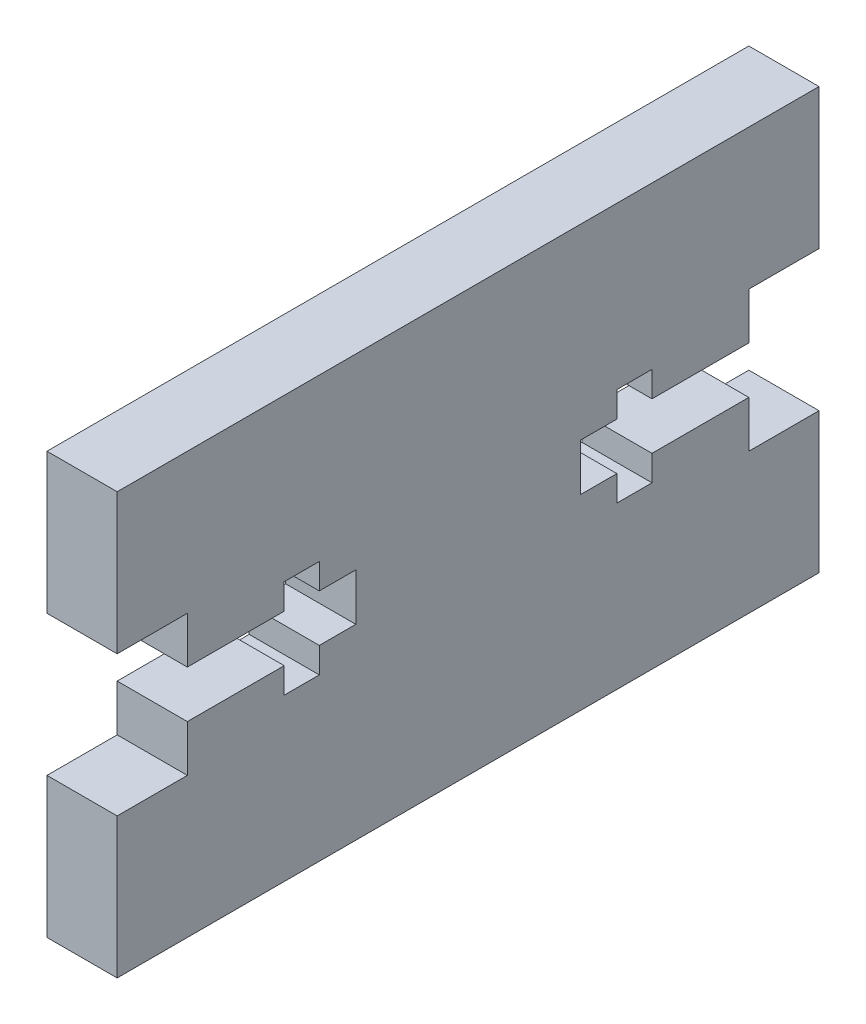
ISO-10303-21;
HEADER;
FILE_DESCRIPTION(('STEP AP214'),'2;1');
FILE_NAME('part.step','',(''),(''),'','','');
FILE_SCHEMA(('AUTOMOTIVE_DESIGN { 1 0 10303 214 1 1 1 1 }'));
ENDSEC;
DATA;
#1=APPLICATION_CONTEXT('core data for automotive mechanical design processes');
#2=APPLICATION_PROTOCOL_DEFINITION('international standard','automotive_design',2000,#1);
#3=PRODUCT_CONTEXT('',#1,'mechanical');
#4=PRODUCT('Part','Part','',(#3));
#5=PRODUCT_RELATED_PRODUCT_CATEGORY('part','',(#4));
#6=PRODUCT_DEFINITION_FORMATION('','',#4);
#7=PRODUCT_DEFINITION_CONTEXT('part definition',#1,'design');
#8=PRODUCT_DEFINITION('design','',#6,#7);
#9=PRODUCT_DEFINITION_SHAPE('','',#8);
#10=(LENGTH_UNIT() NAMED_UNIT(*) SI_UNIT(.MILLI.,.METRE.));
#11=(NAMED_UNIT(*) PLANE_ANGLE_UNIT() SI_UNIT($,.RADIAN.));
#12=(NAMED_UNIT(*) SI_UNIT($,.STERADIAN.) SOLID_ANGLE_UNIT());
#13=UNCERTAINTY_MEASURE_WITH_UNIT(LENGTH_MEASURE(1.E-05),#10,'distance_accuracy_value','');
#14=(GEOMETRIC_REPRESENTATION_CONTEXT(3) GLOBAL_UNCERTAINTY_ASSIGNED_CONTEXT((#13)) GLOBAL_UNIT_ASSIGNED_CONTEXT((#10,
#11,#12)) REPRESENTATION_CONTEXT('',''));
#15=CARTESIAN_POINT('',(0.,0.,0.));
#16=DIRECTION('',(0.,0.,1.));
#17=DIRECTION('',(1.,0.,0.));
#18=AXIS2_PLACEMENT_3D('',#15,#16,#17);
#19=CARTESIAN_POINT('',(-17.78,-19.05,50.8));
#20=DIRECTION('',(1.,0.,0.));
#21=DIRECTION('',(0.,0.,-1.));
#22=AXIS2_PLACEMENT_3D('',#19,#20,#21);
#23=PLANE('',#22);
#24=DIRECTION('',(0.,0.,-1.));
#25=VECTOR('',#24,1.);
#26=CARTESIAN_POINT('',(-17.78,-2.13359999999999,42.037));
#27=LINE('',#26,#25);
#28=CARTESIAN_POINT('',(-17.78,-2.13360000000003,50.8));
#29=VERTEX_POINT('',#28);
#30=CARTESIAN_POINT('',(-17.78,-2.13359999999999,42.037));
#31=VERTEX_POINT('',#30);
#32=EDGE_CURVE('E264',#29,#31,#27,.T.);
#33=ORIENTED_EDGE('',*,*,#32,.T.);
#34=DIRECTION('',(0.,-1.,0.));
#35=VECTOR('',#34,1.);
#36=CARTESIAN_POINT('',(-17.78,-4.44499999999999,42.037));
#37=LINE('',#36,#35);
#38=CARTESIAN_POINT('',(-17.78,-4.44499999999999,42.037));
#39=VERTEX_POINT('',#38);
#40=EDGE_CURVE('E963',#31,#39,#37,.T.);
#41=ORIENTED_EDGE('',*,*,#40,.T.);
#42=DIRECTION('',(0.,0.,-1.));
#43=VECTOR('',#42,1.);
#44=CARTESIAN_POINT('',(-17.78,-4.44499999999998,38.862));
#45=LINE('',#44,#43);
#46=CARTESIAN_POINT('',(-17.78,-4.44499999999998,38.862));
#47=VERTEX_POINT('',#46);
#48=EDGE_CURVE('E981',#39,#47,#45,.T.);
#49=ORIENTED_EDGE('',*,*,#48,.T.);
#50=DIRECTION('',(0.,1.,0.));
#51=VECTOR('',#50,1.);
#52=CARTESIAN_POINT('',(-17.78,-2.13359999999998,38.862));
#53=LINE('',#52,#51);
#54=CARTESIAN_POINT('',(-17.78,-2.13359999999998,38.862));
#55=VERTEX_POINT('',#54);
#56=EDGE_CURVE('E984',#47,#55,#53,.T.);
#57=ORIENTED_EDGE('',*,*,#56,.T.);
#58=DIRECTION('',(0.,0.,-1.));
#59=VECTOR('',#58,1.);
#60=CARTESIAN_POINT('',(-17.78,-2.13359999999998,38.862));
#61=LINE('',#60,#59);
#62=CARTESIAN_POINT('',(-17.78,-2.13359999999997,35.56));
#63=VERTEX_POINT('',#62);
#64=EDGE_CURVE('E987',#55,#63,#61,.T.);
#65=ORIENTED_EDGE('',*,*,#64,.T.);
#66=DIRECTION('',(0.,1.,0.));
#67=VECTOR('',#66,1.);
#68=CARTESIAN_POINT('',(-17.78,-2.13359999999997,35.56));
#69=LINE('',#68,#67);
#70=CARTESIAN_POINT('',(-17.78,2.13360000000003,35.56));
#71=VERTEX_POINT('',#70);
#72=EDGE_CURVE('E990',#63,#71,#69,.T.);
#73=ORIENTED_EDGE('',*,*,#72,.T.);
#74=DIRECTION('',(0.,0.,1.));
#75=VECTOR('',#74,1.);
#76=CARTESIAN_POINT('',(-17.78,2.13360000000002,38.862));
#77=LINE('',#76,#75);
#78=CARTESIAN_POINT('',(-17.78,2.13360000000002,38.862));
#79=VERTEX_POINT('',#78);
#80=EDGE_CURVE('E993',#71,#79,#77,.T.);
#81=ORIENTED_EDGE('',*,*,#80,.T.);
#82=DIRECTION('',(0.,1.,0.));
#83=VECTOR('',#82,1.);
#84=CARTESIAN_POINT('',(-17.78,2.13360000000002,38.862));
#85=LINE('',#84,#83);
#86=CARTESIAN_POINT('',(-17.78,4.44500000000002,38.862));
#87=VERTEX_POINT('',#86);
#88=EDGE_CURVE('E996',#79,#87,#85,.T.);
#89=ORIENTED_EDGE('',*,*,#88,.T.);
#90=DIRECTION('',(0.,0.,1.));
#91=VECTOR('',#90,1.);
#92=CARTESIAN_POINT('',(-17.78,4.44500000000002,38.862));
#93=LINE('',#92,#91);
#94=CARTESIAN_POINT('',(-17.78,4.445,42.037));
#95=VERTEX_POINT('',#94);
#96=EDGE_CURVE('E999',#87,#95,#93,.T.);
#97=ORIENTED_EDGE('',*,*,#96,.T.);
#98=DIRECTION('',(0.,-1.,0.));
#99=VECTOR('',#98,1.);
#100=CARTESIAN_POINT('',(-17.78,4.445,42.037));
#101=LINE('',#100,#99);
#102=CARTESIAN_POINT('',(-17.78,2.13360000000001,42.037));
#103=VERTEX_POINT('',#102);
#104=EDGE_CURVE('E1002',#95,#103,#101,.T.);
#105=ORIENTED_EDGE('',*,*,#104,.T.);
#106=DIRECTION('',(0.,0.,1.));
#107=VECTOR('',#106,1.);
#108=CARTESIAN_POINT('',(-17.78,2.13360000000001,42.037));
#109=LINE('',#108,#107);
#110=CARTESIAN_POINT('',(-17.78,2.13359999999997,50.8));
#111=VERTEX_POINT('',#110);
#112=EDGE_CURVE('E275',#103,#111,#109,.T.);
#113=ORIENTED_EDGE('',*,*,#112,.T.);
#114=DIRECTION('',(0.,-1.,0.));
#115=VECTOR('',#114,1.);
#116=CARTESIAN_POINT('',(-17.78,-19.05,50.8));
#117=LINE('',#116,#115);
#118=CARTESIAN_POINT('',(-17.78,6.35,50.8));
#119=VERTEX_POINT('',#118);
#120=EDGE_CURVE('E291',#119,#111,#117,.T.);
#121=ORIENTED_EDGE('',*,*,#120,.F.);
#122=DIRECTION('',(0.,0.,-1.));
#123=VECTOR('',#122,1.);
#124=CARTESIAN_POINT('',(-17.78,6.35,57.15));
#125=LINE('',#124,#123);
#126=CARTESIAN_POINT('',(-17.78,6.35,57.15));
#127=VERTEX_POINT('',#126);
#128=EDGE_CURVE('E324',#127,#119,#125,.T.);
#129=ORIENTED_EDGE('',*,*,#128,.F.);
#130=DIRECTION('',(0.,1.,0.));
#131=VECTOR('',#130,1.);
#132=CARTESIAN_POINT('',(-17.78,19.05,57.15));
#133=LINE('',#132,#131);
#134=CARTESIAN_POINT('',(-17.78,19.05,57.15));
#135=VERTEX_POINT('',#134);
#136=EDGE_CURVE('E487',#127,#135,#133,.T.);
#137=ORIENTED_EDGE('',*,*,#136,.T.);
#138=DIRECTION('',(0.,0.,-1.));
#139=VECTOR('',#138,1.);
#140=CARTESIAN_POINT('',(-17.78,19.05,50.8));
#141=LINE('',#140,#139);
#142=CARTESIAN_POINT('',(-17.78,19.05,-6.35));
#143=VERTEX_POINT('',#142);
#144=EDGE_CURVE('E482',#135,#143,#141,.T.);
#145=ORIENTED_EDGE('',*,*,#144,.T.);
#146=DIRECTION('',(0.,1.,0.));
#147=VECTOR('',#146,1.);
#148=CARTESIAN_POINT('',(-17.78,19.05,-6.35));
#149=LINE('',#148,#147);
#150=CARTESIAN_POINT('',(-17.78,6.35,-6.35));
#151=VERTEX_POINT('',#150);
#152=EDGE_CURVE('E387',#151,#143,#149,.T.);
#153=ORIENTED_EDGE('',*,*,#152,.F.);
#154=DIRECTION('',(0.,0.,1.));
#155=VECTOR('',#154,1.);
#156=CARTESIAN_POINT('',(-17.78,6.35,-6.35));
#157=LINE('',#156,#155);
#158=CARTESIAN_POINT('',(-17.78,6.35,0.));
#159=VERTEX_POINT('',#158);
#160=EDGE_CURVE('E397',#151,#159,#157,.T.);
#161=ORIENTED_EDGE('',*,*,#160,.T.);
#162=DIRECTION('',(0.,-1.,0.));
#163=VECTOR('',#162,1.);
#164=CARTESIAN_POINT('',(-17.78,-19.05,0.));
#165=LINE('',#164,#163);
#166=CARTESIAN_POINT('',(-17.78,2.13359999999997,0.));
#167=VERTEX_POINT('',#166);
#168=EDGE_CURVE('E433',#159,#167,#165,.T.);
#169=ORIENTED_EDGE('',*,*,#168,.T.);
#170=DIRECTION('',(0.,0.,-1.));
#171=VECTOR('',#170,1.);
#172=CARTESIAN_POINT('',(-17.78,2.13360000000001,8.76299999999999));
#173=LINE('',#172,#171);
#174=CARTESIAN_POINT('',(-17.78,2.13360000000001,8.76299999999999));
#175=VERTEX_POINT('',#174);
#176=EDGE_CURVE('E359',#175,#167,#173,.T.);
#177=ORIENTED_EDGE('',*,*,#176,.F.);
#178=DIRECTION('',(0.,-1.,0.));
#179=VECTOR('',#178,1.);
#180=CARTESIAN_POINT('',(-17.78,4.445,8.76299999999997));
#181=LINE('',#180,#179);
#182=CARTESIAN_POINT('',(-17.78,4.445,8.76299999999997));
#183=VERTEX_POINT('',#182);
#184=EDGE_CURVE('E356',#183,#175,#181,.T.);
#185=ORIENTED_EDGE('',*,*,#184,.F.);
#186=DIRECTION('',(0.,0.,-1.));
#187=VECTOR('',#186,1.);
#188=CARTESIAN_POINT('',(-17.78,4.44500000000002,11.938));
#189=LINE('',#188,#187);
#190=CARTESIAN_POINT('',(-17.78,4.44500000000002,11.938));
#191=VERTEX_POINT('',#190);
#192=EDGE_CURVE('E353',#191,#183,#189,.T.);
#193=ORIENTED_EDGE('',*,*,#192,.F.);
#194=DIRECTION('',(0.,1.,0.));
#195=VECTOR('',#194,1.);
#196=CARTESIAN_POINT('',(-17.78,2.13360000000002,11.938));
#197=LINE('',#196,#195);
#198=CARTESIAN_POINT('',(-17.78,2.13360000000002,11.938));
#199=VERTEX_POINT('',#198);
#200=EDGE_CURVE('E350',#199,#191,#197,.T.);
#201=ORIENTED_EDGE('',*,*,#200,.F.);
#202=DIRECTION('',(0.,0.,-1.));
#203=VECTOR('',#202,1.);
#204=CARTESIAN_POINT('',(-17.78,2.13360000000002,11.938));
#205=LINE('',#204,#203);
#206=CARTESIAN_POINT('',(-17.78,2.13360000000003,15.24));
#207=VERTEX_POINT('',#206);
#208=EDGE_CURVE('E347',#207,#199,#205,.T.);
#209=ORIENTED_EDGE('',*,*,#208,.F.);
#210=DIRECTION('',(0.,1.,0.));
#211=VECTOR('',#210,1.);
#212=CARTESIAN_POINT('',(-17.78,-2.13359999999997,15.24));
#213=LINE('',#212,#211);
#214=CARTESIAN_POINT('',(-17.78,-2.13359999999997,15.24));
#215=VERTEX_POINT('',#214);
#216=EDGE_CURVE('E344',#215,#207,#213,.T.);
#217=ORIENTED_EDGE('',*,*,#216,.F.);
#218=DIRECTION('',(0.,0.,1.));
#219=VECTOR('',#218,1.);
#220=CARTESIAN_POINT('',(-17.78,-2.13359999999998,11.938));
#221=LINE('',#220,#219);
#222=CARTESIAN_POINT('',(-17.78,-2.13359999999998,11.938));
#223=VERTEX_POINT('',#222);
#224=EDGE_CURVE('E341',#223,#215,#221,.T.);
#225=ORIENTED_EDGE('',*,*,#224,.F.);
#226=DIRECTION('',(0.,1.,0.));
#227=VECTOR('',#226,1.);
#228=CARTESIAN_POINT('',(-17.78,-2.13359999999998,11.938));
#229=LINE('',#228,#227);
#230=CARTESIAN_POINT('',(-17.78,-4.44499999999998,11.938));
#231=VERTEX_POINT('',#230);
#232=EDGE_CURVE('E338',#231,#223,#229,.T.);
#233=ORIENTED_EDGE('',*,*,#232,.F.);
#234=DIRECTION('',(0.,0.,1.));
#235=VECTOR('',#234,1.);
#236=CARTESIAN_POINT('',(-17.78,-4.44499999999998,11.938));
#237=LINE('',#236,#235);
#238=CARTESIAN_POINT('',(-17.78,-4.44499999999999,8.76300000000002));
#239=VERTEX_POINT('',#238);
#240=EDGE_CURVE('E335',#239,#231,#237,.T.);
#241=ORIENTED_EDGE('',*,*,#240,.F.);
#242=DIRECTION('',(0.,-1.,0.));
#243=VECTOR('',#242,1.);
#244=CARTESIAN_POINT('',(-17.78,-4.44499999999999,8.76300000000002));
#245=LINE('',#244,#243);
#246=CARTESIAN_POINT('',(-17.78,-2.13359999999999,8.76299999999999));
#247=VERTEX_POINT('',#246);
#248=EDGE_CURVE('E332',#247,#239,#245,.T.);
#249=ORIENTED_EDGE('',*,*,#248,.F.);
#250=DIRECTION('',(0.,0.,1.));
#251=VECTOR('',#250,1.);
#252=CARTESIAN_POINT('',(-17.78,-2.13359999999999,8.76299999999999));
#253=LINE('',#252,#251);
#254=CARTESIAN_POINT('',(-17.78,-2.13360000000003,0.));
#255=VERTEX_POINT('',#254);
#256=EDGE_CURVE('E319',#255,#247,#253,.T.);
#257=ORIENTED_EDGE('',*,*,#256,.F.);
#258=CARTESIAN_POINT('',(-17.78,-6.35,0.));
#259=VERTEX_POINT('',#258);
#260=EDGE_CURVE('E425',#255,#259,#165,.T.);
#261=ORIENTED_EDGE('',*,*,#260,.T.);
#262=DIRECTION('',(0.,0.,1.));
#263=VECTOR('',#262,1.);
#264=CARTESIAN_POINT('',(-17.78,-6.35,-6.35));
#265=LINE('',#264,#263);
#266=CARTESIAN_POINT('',(-17.78,-6.35,-6.35));
#267=VERTEX_POINT('',#266);
#268=EDGE_CURVE('E419',#267,#259,#265,.T.);
#269=ORIENTED_EDGE('',*,*,#268,.F.);
#270=DIRECTION('',(0.,1.,0.));
#271=VECTOR('',#270,1.);
#272=CARTESIAN_POINT('',(-17.78,-19.05,-6.35));
#273=LINE('',#272,#271);
#274=CARTESIAN_POINT('',(-17.78,-19.05,-6.35));
#275=VERTEX_POINT('',#274);
#276=EDGE_CURVE('E405',#275,#267,#273,.T.);
#277=ORIENTED_EDGE('',*,*,#276,.F.);
#278=DIRECTION('',(0.,0.,-1.));
#279=VECTOR('',#278,1.);
#280=CARTESIAN_POINT('',(-17.78,-19.05,50.8));
#281=LINE('',#280,#279);
#282=CARTESIAN_POINT('',(-17.78,-19.05,57.15));
#283=VERTEX_POINT('',#282);
#284=EDGE_CURVE('E474',#283,#275,#281,.T.);
#285=ORIENTED_EDGE('',*,*,#284,.F.);
#286=DIRECTION('',(0.,1.,0.));
#287=VECTOR('',#286,1.);
#288=CARTESIAN_POINT('',(-17.78,-19.05,57.15));
#289=LINE('',#288,#287);
#290=CARTESIAN_POINT('',(-17.78,-6.35,57.15));
#291=VERTEX_POINT('',#290);
#292=EDGE_CURVE('E323',#283,#291,#289,.T.);
#293=ORIENTED_EDGE('',*,*,#292,.T.);
#294=DIRECTION('',(0.,0.,-1.));
#295=VECTOR('',#294,1.);
#296=CARTESIAN_POINT('',(-17.78,-6.35,57.15));
#297=LINE('',#296,#295);
#298=CARTESIAN_POINT('',(-17.78,-6.35,50.8));
#299=VERTEX_POINT('',#298);
#300=EDGE_CURVE('E289',#291,#299,#297,.T.);
#301=ORIENTED_EDGE('',*,*,#300,.T.);
#302=EDGE_CURVE('E281',#29,#299,#117,.T.);
#303=ORIENTED_EDGE('',*,*,#302,.F.);
#304=EDGE_LOOP('',(#33,#41,#49,#57,#65,#73,#81,#89,#97,#105,#113,#121,#129,#137,#145,#153,#161,
#169,#177,#185,#193,#201,#209,#217,#225,#233,#241,#249,#257,#261,#269,#277,#285,#293,#301,#303));
#305=FACE_BOUND('',#304,.T.);
#306=ADVANCED_FACE('F33',(#305),#23,.F.);
#307=CARTESIAN_POINT('',(-11.43,-19.05,50.8));
#308=DIRECTION('',(-1.,0.,0.));
#309=DIRECTION('',(0.,0.,1.));
#310=AXIS2_PLACEMENT_3D('',#307,#308,#309);
#311=PLANE('',#310);
#312=DIRECTION('',(0.,0.,-1.));
#313=VECTOR('',#312,1.);
#314=CARTESIAN_POINT('',(-11.43,-2.13360000000002,50.8000000000001));
#315=LINE('',#314,#313);
#316=CARTESIAN_POINT('',(-11.43,-2.13360000000003,50.8));
#317=VERTEX_POINT('',#316);
#318=CARTESIAN_POINT('',(-11.43,-2.13359999999999,42.037));
#319=VERTEX_POINT('',#318);
#320=EDGE_CURVE('E613',#317,#319,#315,.T.);
#321=ORIENTED_EDGE('',*,*,#320,.F.);
#322=DIRECTION('',(0.,1.,0.));
#323=VECTOR('',#322,1.);
#324=CARTESIAN_POINT('',(-11.43,-19.05,50.8));
#325=LINE('',#324,#323);
#326=CARTESIAN_POINT('',(-11.43,-6.35,50.8));
#327=VERTEX_POINT('',#326);
#328=EDGE_CURVE('E284',#327,#317,#325,.T.);
#329=ORIENTED_EDGE('',*,*,#328,.F.);
#330=DIRECTION('',(0.,0.,-1.));
#331=VECTOR('',#330,1.);
#332=CARTESIAN_POINT('',(-11.43,-6.35,57.15));
#333=LINE('',#332,#331);
#334=CARTESIAN_POINT('',(-11.43,-6.35,57.15));
#335=VERTEX_POINT('',#334);
#336=EDGE_CURVE('E314',#335,#327,#333,.T.);
#337=ORIENTED_EDGE('',*,*,#336,.F.);
#338=DIRECTION('',(0.,-1.,0.));
#339=VECTOR('',#338,1.);
#340=CARTESIAN_POINT('',(-11.43,-19.05,57.15));
#341=LINE('',#340,#339);
#342=CARTESIAN_POINT('',(-11.43,-19.05,57.15));
#343=VERTEX_POINT('',#342);
#344=EDGE_CURVE('E624',#335,#343,#341,.T.);
#345=ORIENTED_EDGE('',*,*,#344,.T.);
#346=DIRECTION('',(0.,0.,-1.));
#347=VECTOR('',#346,1.);
#348=CARTESIAN_POINT('',(-11.43,-19.05,50.8));
#349=LINE('',#348,#347);
#350=CARTESIAN_POINT('',(-11.43,-19.05,-6.35));
#351=VERTEX_POINT('',#350);
#352=EDGE_CURVE('E475',#343,#351,#349,.T.);
#353=ORIENTED_EDGE('',*,*,#352,.T.);
#354=DIRECTION('',(0.,-1.,0.));
#355=VECTOR('',#354,1.);
#356=CARTESIAN_POINT('',(-11.43,-19.05,-6.35));
#357=LINE('',#356,#355);
#358=CARTESIAN_POINT('',(-11.43,-6.35,-6.35));
#359=VERTEX_POINT('',#358);
#360=EDGE_CURVE('E410',#359,#351,#357,.T.);
#361=ORIENTED_EDGE('',*,*,#360,.F.);
#362=DIRECTION('',(0.,0.,1.));
#363=VECTOR('',#362,1.);
#364=CARTESIAN_POINT('',(-11.43,-6.35,-6.35));
#365=LINE('',#364,#363);
#366=CARTESIAN_POINT('',(-11.43,-6.35,0.));
#367=VERTEX_POINT('',#366);
#368=EDGE_CURVE('E414',#359,#367,#365,.T.);
#369=ORIENTED_EDGE('',*,*,#368,.T.);
#370=DIRECTION('',(0.,1.,0.));
#371=VECTOR('',#370,1.);
#372=CARTESIAN_POINT('',(-11.43,-19.05,0.));
#373=LINE('',#372,#371);
#374=CARTESIAN_POINT('',(-11.43,-2.13360000000003,0.));
#375=VERTEX_POINT('',#374);
#376=EDGE_CURVE('E292',#367,#375,#373,.T.);
#377=ORIENTED_EDGE('',*,*,#376,.T.);
#378=DIRECTION('',(0.,0.,1.));
#379=VECTOR('',#378,1.);
#380=CARTESIAN_POINT('',(-11.43,-2.13359999999984,50.7999999999999));
#381=LINE('',#380,#379);
#382=CARTESIAN_POINT('',(-11.43,-2.13359999999999,8.76299999999999));
#383=VERTEX_POINT('',#382);
#384=EDGE_CURVE('E443',#375,#383,#381,.T.);
#385=ORIENTED_EDGE('',*,*,#384,.T.);
#386=DIRECTION('',(0.,-1.,0.));
#387=VECTOR('',#386,1.);
#388=CARTESIAN_POINT('',(-11.43,-19.0500000000005,8.76300000000019));
#389=LINE('',#388,#387);
#390=CARTESIAN_POINT('',(-11.43,-4.44499999999999,8.76300000000002));
#391=VERTEX_POINT('',#390);
#392=EDGE_CURVE('E472',#383,#391,#389,.T.);
#393=ORIENTED_EDGE('',*,*,#392,.T.);
#394=DIRECTION('',(0.,0.,1.));
#395=VECTOR('',#394,1.);
#396=CARTESIAN_POINT('',(-11.43,-4.44499999999984,50.7999999999999));
#397=LINE('',#396,#395);
#398=CARTESIAN_POINT('',(-11.43,-4.44499999999998,11.938));
#399=VERTEX_POINT('',#398);
#400=EDGE_CURVE('E470',#391,#399,#397,.T.);
#401=ORIENTED_EDGE('',*,*,#400,.T.);
#402=DIRECTION('',(0.,1.,0.));
#403=VECTOR('',#402,1.);
#404=CARTESIAN_POINT('',(-11.43,-19.0500000000005,11.9380000000002));
#405=LINE('',#404,#403);
#406=CARTESIAN_POINT('',(-11.43,-2.13359999999998,11.938));
#407=VERTEX_POINT('',#406);
#408=EDGE_CURVE('E467',#399,#407,#405,.T.);
#409=ORIENTED_EDGE('',*,*,#408,.T.);
#410=DIRECTION('',(0.,0.,1.));
#411=VECTOR('',#410,1.);
#412=CARTESIAN_POINT('',(-11.43,-2.13359999999985,50.7999999999999));
#413=LINE('',#412,#411);
#414=CARTESIAN_POINT('',(-11.43,-2.13359999999997,15.24));
#415=VERTEX_POINT('',#414);
#416=EDGE_CURVE('E464',#407,#415,#413,.T.);
#417=ORIENTED_EDGE('',*,*,#416,.T.);
#418=DIRECTION('',(0.,1.,0.));
#419=VECTOR('',#418,1.);
#420=CARTESIAN_POINT('',(-11.43,-19.05,15.24));
#421=LINE('',#420,#419);
#422=CARTESIAN_POINT('',(-11.43,2.13360000000003,15.24));
#423=VERTEX_POINT('',#422);
#424=EDGE_CURVE('E461',#415,#423,#421,.T.);
#425=ORIENTED_EDGE('',*,*,#424,.T.);
#426=DIRECTION('',(0.,0.,-1.));
#427=VECTOR('',#426,1.);
#428=CARTESIAN_POINT('',(-11.43,2.13360000000016,50.7999999999999));
#429=LINE('',#428,#427);
#430=CARTESIAN_POINT('',(-11.43,2.13360000000002,11.938));
#431=VERTEX_POINT('',#430);
#432=EDGE_CURVE('E458',#423,#431,#429,.T.);
#433=ORIENTED_EDGE('',*,*,#432,.T.);
#434=DIRECTION('',(0.,1.,0.));
#435=VECTOR('',#434,1.);
#436=CARTESIAN_POINT('',(-11.43,-19.0500000000005,11.9380000000003));
#437=LINE('',#436,#435);
#438=CARTESIAN_POINT('',(-11.43,4.44500000000002,11.938));
#439=VERTEX_POINT('',#438);
#440=EDGE_CURVE('E455',#431,#439,#437,.T.);
#441=ORIENTED_EDGE('',*,*,#440,.T.);
#442=DIRECTION('',(0.,0.,-1.));
#443=VECTOR('',#442,1.);
#444=CARTESIAN_POINT('',(-11.43,4.44500000000018,50.7999999999999));
#445=LINE('',#444,#443);
#446=CARTESIAN_POINT('',(-11.43,4.445,8.76299999999997));
#447=VERTEX_POINT('',#446);
#448=EDGE_CURVE('E452',#439,#447,#445,.T.);
#449=ORIENTED_EDGE('',*,*,#448,.T.);
#450=DIRECTION('',(0.,-1.,0.));
#451=VECTOR('',#450,1.);
#452=CARTESIAN_POINT('',(-11.43,-19.0500000000005,8.76300000000025));
#453=LINE('',#452,#451);
#454=CARTESIAN_POINT('',(-11.43,2.13360000000001,8.76299999999999));
#455=VERTEX_POINT('',#454);
#456=EDGE_CURVE('E449',#447,#455,#453,.T.);
#457=ORIENTED_EDGE('',*,*,#456,.T.);
#458=DIRECTION('',(0.,0.,-1.));
#459=VECTOR('',#458,1.);
#460=CARTESIAN_POINT('',(-11.43,2.13360000000016,50.7999999999999));
#461=LINE('',#460,#459);
#462=CARTESIAN_POINT('',(-11.43,2.13359999999997,0.));
#463=VERTEX_POINT('',#462);
#464=EDGE_CURVE('E446',#455,#463,#461,.T.);
#465=ORIENTED_EDGE('',*,*,#464,.T.);
#466=CARTESIAN_POINT('',(-11.43,6.35,0.));
#467=VERTEX_POINT('',#466);
#468=EDGE_CURVE('E297',#463,#467,#373,.T.);
#469=ORIENTED_EDGE('',*,*,#468,.T.);
#470=DIRECTION('',(0.,0.,1.));
#471=VECTOR('',#470,1.);
#472=CARTESIAN_POINT('',(-11.43,6.35,-6.35));
#473=LINE('',#472,#471);
#474=CARTESIAN_POINT('',(-11.43,6.35,-6.35));
#475=VERTEX_POINT('',#474);
#476=EDGE_CURVE('E401',#475,#467,#473,.T.);
#477=ORIENTED_EDGE('',*,*,#476,.F.);
#478=DIRECTION('',(0.,-1.,0.));
#479=VECTOR('',#478,1.);
#480=CARTESIAN_POINT('',(-11.43,19.05,-6.35));
#481=LINE('',#480,#479);
#482=CARTESIAN_POINT('',(-11.43,19.05,-6.35));
#483=VERTEX_POINT('',#482);
#484=EDGE_CURVE('E393',#483,#475,#481,.T.);
#485=ORIENTED_EDGE('',*,*,#484,.F.);
#486=DIRECTION('',(0.,0.,-1.));
#487=VECTOR('',#486,1.);
#488=CARTESIAN_POINT('',(-11.43,19.05,50.8));
#489=LINE('',#488,#487);
#490=CARTESIAN_POINT('',(-11.43,19.05,57.15));
#491=VERTEX_POINT('',#490);
#492=EDGE_CURVE('E479',#491,#483,#489,.T.);
#493=ORIENTED_EDGE('',*,*,#492,.F.);
#494=DIRECTION('',(0.,-1.,0.));
#495=VECTOR('',#494,1.);
#496=CARTESIAN_POINT('',(-11.43,19.05,57.15));
#497=LINE('',#496,#495);
#498=CARTESIAN_POINT('',(-11.43,6.35,57.15));
#499=VERTEX_POINT('',#498);
#500=EDGE_CURVE('E604',#491,#499,#497,.T.);
#501=ORIENTED_EDGE('',*,*,#500,.T.);
#502=DIRECTION('',(0.,0.,-1.));
#503=VECTOR('',#502,1.);
#504=CARTESIAN_POINT('',(-11.43,6.35,57.15));
#505=LINE('',#504,#503);
#506=CARTESIAN_POINT('',(-11.43,6.35,50.8));
#507=VERTEX_POINT('',#506);
#508=EDGE_CURVE('E601',#499,#507,#505,.T.);
#509=ORIENTED_EDGE('',*,*,#508,.T.);
#510=CARTESIAN_POINT('',(-11.43,2.13359999999997,50.8));
#511=VERTEX_POINT('',#510);
#512=EDGE_CURVE('E54',#511,#507,#325,.T.);
#513=ORIENTED_EDGE('',*,*,#512,.F.);
#514=DIRECTION('',(0.,0.,1.));
#515=VECTOR('',#514,1.);
#516=CARTESIAN_POINT('',(-11.43,2.13359999999998,50.8000000000001));
#517=LINE('',#516,#515);
#518=CARTESIAN_POINT('',(-11.43,2.13360000000001,42.037));
#519=VERTEX_POINT('',#518);
#520=EDGE_CURVE('E47',#519,#511,#517,.T.);
#521=ORIENTED_EDGE('',*,*,#520,.F.);
#522=DIRECTION('',(0.,-1.,0.));
#523=VECTOR('',#522,1.);
#524=CARTESIAN_POINT('',(-11.43,-19.0499999999999,42.0369999999998));
#525=LINE('',#524,#523);
#526=CARTESIAN_POINT('',(-11.43,4.445,42.037));
#527=VERTEX_POINT('',#526);
#528=EDGE_CURVE('E285',#527,#519,#525,.T.);
#529=ORIENTED_EDGE('',*,*,#528,.F.);
#530=DIRECTION('',(0.,0.,1.));
#531=VECTOR('',#530,1.);
#532=CARTESIAN_POINT('',(-11.43,4.44499999999997,50.8000000000001));
#533=LINE('',#532,#531);
#534=CARTESIAN_POINT('',(-11.43,4.44500000000002,38.862));
#535=VERTEX_POINT('',#534);
#536=EDGE_CURVE('E1008',#535,#527,#533,.T.);
#537=ORIENTED_EDGE('',*,*,#536,.F.);
#538=DIRECTION('',(0.,1.,0.));
#539=VECTOR('',#538,1.);
#540=CARTESIAN_POINT('',(-11.43,-19.0499999999999,38.8619999999997));
#541=LINE('',#540,#539);
#542=CARTESIAN_POINT('',(-11.43,2.13360000000002,38.862));
#543=VERTEX_POINT('',#542);
#544=EDGE_CURVE('E1010',#543,#535,#541,.T.);
#545=ORIENTED_EDGE('',*,*,#544,.F.);
#546=DIRECTION('',(0.,0.,1.));
#547=VECTOR('',#546,1.);
#548=CARTESIAN_POINT('',(-11.43,2.13359999999997,50.8000000000001));
#549=LINE('',#548,#547);
#550=CARTESIAN_POINT('',(-11.43,2.13360000000003,35.56));
#551=VERTEX_POINT('',#550);
#552=EDGE_CURVE('E1014',#551,#543,#549,.T.);
#553=ORIENTED_EDGE('',*,*,#552,.F.);
#554=DIRECTION('',(0.,1.,0.));
#555=VECTOR('',#554,1.);
#556=CARTESIAN_POINT('',(-11.43,-19.05,35.56));
#557=LINE('',#556,#555);
#558=CARTESIAN_POINT('',(-11.43,-2.13359999999997,35.56));
#559=VERTEX_POINT('',#558);
#560=EDGE_CURVE('E1016',#559,#551,#557,.T.);
#561=ORIENTED_EDGE('',*,*,#560,.F.);
#562=DIRECTION('',(0.,0.,-1.));
#563=VECTOR('',#562,1.);
#564=CARTESIAN_POINT('',(-11.43,-2.13360000000002,50.8000000000001));
#565=LINE('',#564,#563);
#566=CARTESIAN_POINT('',(-11.43,-2.13359999999998,38.862));
#567=VERTEX_POINT('',#566);
#568=EDGE_CURVE('E1018',#567,#559,#565,.T.);
#569=ORIENTED_EDGE('',*,*,#568,.F.);
#570=DIRECTION('',(0.,1.,0.));
#571=VECTOR('',#570,1.);
#572=CARTESIAN_POINT('',(-11.43,-19.0499999999999,38.8619999999998));
#573=LINE('',#572,#571);
#574=CARTESIAN_POINT('',(-11.43,-4.44499999999998,38.862));
#575=VERTEX_POINT('',#574);
#576=EDGE_CURVE('E1020',#575,#567,#573,.T.);
#577=ORIENTED_EDGE('',*,*,#576,.F.);
#578=DIRECTION('',(0.,0.,-1.));
#579=VECTOR('',#578,1.);
#580=CARTESIAN_POINT('',(-11.43,-4.44500000000002,50.8));
#581=LINE('',#580,#579);
#582=CARTESIAN_POINT('',(-11.43,-4.44499999999999,42.037));
#583=VERTEX_POINT('',#582);
#584=EDGE_CURVE('E40',#583,#575,#581,.T.);
#585=ORIENTED_EDGE('',*,*,#584,.F.);
#586=DIRECTION('',(0.,-1.,0.));
#587=VECTOR('',#586,1.);
#588=CARTESIAN_POINT('',(-11.43,-19.0499999999999,42.0369999999998));
#589=LINE('',#588,#587);
#590=EDGE_CURVE('E11',#319,#583,#589,.T.);
#591=ORIENTED_EDGE('',*,*,#590,.F.);
#592=EDGE_LOOP('',(#321,#329,#337,#345,#353,#361,#369,#377,#385,#393,#401,#409,#417,#425,#433,
#441,#449,#457,#465,#469,#477,#485,#493,#501,#509,#513,#521,#529,#537,#545,#553,#561,#569,#577,
#585,#591));
#593=FACE_BOUND('',#592,.T.);
#594=ADVANCED_FACE('F509',(#593),#311,.F.);
#595=CARTESIAN_POINT('',(0.,0.,50.8));
#596=DIRECTION('',(0.,0.,-1.));
#597=DIRECTION('',(-1.,0.,0.));
#598=AXIS2_PLACEMENT_3D('',#595,#596,#597);
#599=PLANE('',#598);
#600=DIRECTION('',(1.,0.,0.));
#601=VECTOR('',#600,1.);
#602=CARTESIAN_POINT('',(0.,-2.13360000000003,50.8));
#603=LINE('',#602,#601);
#604=EDGE_CURVE('E267',#29,#317,#603,.T.);
#605=ORIENTED_EDGE('',*,*,#604,.F.);
#606=ORIENTED_EDGE('',*,*,#302,.T.);
#607=DIRECTION('',(1.,0.,0.));
#608=VECTOR('',#607,1.);
#609=CARTESIAN_POINT('',(-17.78,-6.35,50.8));
#610=LINE('',#609,#608);
#611=EDGE_CURVE('E320',#299,#327,#610,.T.);
#612=ORIENTED_EDGE('',*,*,#611,.T.);
#613=ORIENTED_EDGE('',*,*,#328,.T.);
#614=EDGE_LOOP('',(#605,#606,#612,#613));
#615=FACE_BOUND('',#614,.T.);
#616=ADVANCED_FACE('F279',(#615),#599,.F.);
#617=DIRECTION('',(-1.,0.,0.));
#618=VECTOR('',#617,1.);
#619=CARTESIAN_POINT('',(0.,2.13359999999997,50.8));
#620=LINE('',#619,#618);
#621=EDGE_CURVE('E286',#511,#111,#620,.T.);
#622=ORIENTED_EDGE('',*,*,#621,.F.);
#623=ORIENTED_EDGE('',*,*,#512,.T.);
#624=DIRECTION('',(-1.,0.,0.));
#625=VECTOR('',#624,1.);
#626=CARTESIAN_POINT('',(-17.78,6.35,50.8));
#627=LINE('',#626,#625);
#628=EDGE_CURVE('E611',#507,#119,#627,.T.);
#629=ORIENTED_EDGE('',*,*,#628,.T.);
#630=ORIENTED_EDGE('',*,*,#120,.T.);
#631=EDGE_LOOP('',(#622,#623,#629,#630));
#632=FACE_BOUND('',#631,.T.);
#633=ADVANCED_FACE('F577',(#632),#599,.F.);
#634=CARTESIAN_POINT('',(0.,0.,0.));
#635=DIRECTION('',(0.,0.,-1.));
#636=DIRECTION('',(-1.,0.,0.));
#637=AXIS2_PLACEMENT_3D('',#634,#635,#636);
#638=PLANE('',#637);
#639=DIRECTION('',(-1.,0.,0.));
#640=VECTOR('',#639,1.);
#641=CARTESIAN_POINT('',(-11.42995,-2.13360000000003,0.));
#642=LINE('',#641,#640);
#643=EDGE_CURVE('E362',#375,#255,#642,.T.);
#644=ORIENTED_EDGE('',*,*,#643,.F.);
#645=ORIENTED_EDGE('',*,*,#376,.F.);
#646=DIRECTION('',(1.,0.,0.));
#647=VECTOR('',#646,1.);
#648=CARTESIAN_POINT('',(-17.78,-6.35,0.));
#649=LINE('',#648,#647);
#650=EDGE_CURVE('E404',#259,#367,#649,.T.);
#651=ORIENTED_EDGE('',*,*,#650,.F.);
#652=ORIENTED_EDGE('',*,*,#260,.F.);
#653=EDGE_LOOP('',(#644,#645,#651,#652));
#654=FACE_BOUND('',#653,.T.);
#655=ADVANCED_FACE('F552',(#654),#638,.T.);
#656=DIRECTION('',(-1.,0.,0.));
#657=VECTOR('',#656,1.);
#658=CARTESIAN_POINT('',(-11.42995,2.13359999999997,0.));
#659=LINE('',#658,#657);
#660=EDGE_CURVE('E365',#463,#167,#659,.T.);
#661=ORIENTED_EDGE('',*,*,#660,.T.);
#662=ORIENTED_EDGE('',*,*,#168,.F.);
#663=DIRECTION('',(-1.,0.,0.));
#664=VECTOR('',#663,1.);
#665=CARTESIAN_POINT('',(-17.78,6.35,0.));
#666=LINE('',#665,#664);
#667=EDGE_CURVE('E364',#467,#159,#666,.T.);
#668=ORIENTED_EDGE('',*,*,#667,.F.);
#669=ORIENTED_EDGE('',*,*,#468,.F.);
#670=EDGE_LOOP('',(#661,#662,#668,#669));
#671=FACE_BOUND('',#670,.T.);
#672=ADVANCED_FACE('F504',(#671),#638,.T.);
#673=CARTESIAN_POINT('',(-17.78,-19.05,50.8));
#674=DIRECTION('',(0.,1.,0.));
#675=DIRECTION('',(0.,0.,1.));
#676=AXIS2_PLACEMENT_3D('',#673,#674,#675);
#677=PLANE('',#676);
#678=ORIENTED_EDGE('',*,*,#284,.T.);
#679=DIRECTION('',(-1.,0.,0.));
#680=VECTOR('',#679,1.);
#681=CARTESIAN_POINT('',(-17.78,-19.05,-6.35));
#682=LINE('',#681,#680);
#683=EDGE_CURVE('E412',#351,#275,#682,.T.);
#684=ORIENTED_EDGE('',*,*,#683,.F.);
#685=ORIENTED_EDGE('',*,*,#352,.F.);
#686=DIRECTION('',(-1.,0.,0.));
#687=VECTOR('',#686,1.);
#688=CARTESIAN_POINT('',(-17.78,-19.05,57.15));
#689=LINE('',#688,#687);
#690=EDGE_CURVE('E623',#343,#283,#689,.T.);
#691=ORIENTED_EDGE('',*,*,#690,.T.);
#692=EDGE_LOOP('',(#678,#684,#685,#691));
#693=FACE_BOUND('',#692,.T.);
#694=ADVANCED_FACE('F581',(#693),#677,.F.);
#695=CARTESIAN_POINT('',(-17.78,19.05,50.8));
#696=DIRECTION('',(0.,-1.,0.));
#697=DIRECTION('',(0.,0.,-1.));
#698=AXIS2_PLACEMENT_3D('',#695,#696,#697);
#699=PLANE('',#698);
#700=ORIENTED_EDGE('',*,*,#492,.T.);
#701=DIRECTION('',(1.,0.,0.));
#702=VECTOR('',#701,1.);
#703=CARTESIAN_POINT('',(-17.78,19.05,-6.35));
#704=LINE('',#703,#702);
#705=EDGE_CURVE('E390',#143,#483,#704,.T.);
#706=ORIENTED_EDGE('',*,*,#705,.F.);
#707=ORIENTED_EDGE('',*,*,#144,.F.);
#708=DIRECTION('',(1.,0.,0.));
#709=VECTOR('',#708,1.);
#710=CARTESIAN_POINT('',(-17.78,19.05,57.15));
#711=LINE('',#710,#709);
#712=EDGE_CURVE('E608',#135,#491,#711,.T.);
#713=ORIENTED_EDGE('',*,*,#712,.T.);
#714=EDGE_LOOP('',(#700,#706,#707,#713));
#715=FACE_BOUND('',#714,.T.);
#716=ADVANCED_FACE('F491',(#715),#699,.F.);
#717=CARTESIAN_POINT('',(-17.78,-6.35,-6.35));
#718=DIRECTION('',(0.,-1.,0.));
#719=DIRECTION('',(0.,0.,-1.));
#720=AXIS2_PLACEMENT_3D('',#717,#718,#719);
#721=PLANE('',#720);
#722=ORIENTED_EDGE('',*,*,#650,.T.);
#723=ORIENTED_EDGE('',*,*,#368,.F.);
#724=DIRECTION('',(1.,0.,0.));
#725=VECTOR('',#724,1.);
#726=CARTESIAN_POINT('',(-17.78,-6.35,-6.35));
#727=LINE('',#726,#725);
#728=EDGE_CURVE('E408',#267,#359,#727,.T.);
#729=ORIENTED_EDGE('',*,*,#728,.F.);
#730=ORIENTED_EDGE('',*,*,#268,.T.);
#731=EDGE_LOOP('',(#722,#723,#729,#730));
#732=FACE_BOUND('',#731,.T.);
#733=ADVANCED_FACE('F557',(#732),#721,.F.);
#734=CARTESIAN_POINT('',(0.,0.,-6.35));
#735=DIRECTION('',(0.,0.,-1.));
#736=DIRECTION('',(-1.,0.,0.));
#737=AXIS2_PLACEMENT_3D('',#734,#735,#736);
#738=PLANE('',#737);
#739=ORIENTED_EDGE('',*,*,#276,.T.);
#740=ORIENTED_EDGE('',*,*,#728,.T.);
#741=ORIENTED_EDGE('',*,*,#360,.T.);
#742=ORIENTED_EDGE('',*,*,#683,.T.);
#743=EDGE_LOOP('',(#739,#740,#741,#742));
#744=FACE_BOUND('',#743,.T.);
#745=ADVANCED_FACE('F558',(#744),#738,.T.);
#746=CARTESIAN_POINT('',(-17.78,6.35,-6.35));
#747=DIRECTION('',(0.,1.,0.));
#748=DIRECTION('',(0.,0.,1.));
#749=AXIS2_PLACEMENT_3D('',#746,#747,#748);
#750=PLANE('',#749);
#751=ORIENTED_EDGE('',*,*,#667,.T.);
#752=ORIENTED_EDGE('',*,*,#160,.F.);
#753=DIRECTION('',(-1.,0.,0.));
#754=VECTOR('',#753,1.);
#755=CARTESIAN_POINT('',(-17.78,6.35,-6.35));
#756=LINE('',#755,#754);
#757=EDGE_CURVE('E395',#475,#151,#756,.T.);
#758=ORIENTED_EDGE('',*,*,#757,.F.);
#759=ORIENTED_EDGE('',*,*,#476,.T.);
#760=EDGE_LOOP('',(#751,#752,#758,#759));
#761=FACE_BOUND('',#760,.T.);
#762=ADVANCED_FACE('F499',(#761),#750,.F.);
#763=CARTESIAN_POINT('',(0.,0.,-6.35));
#764=DIRECTION('',(0.,0.,1.));
#765=DIRECTION('',(1.,0.,0.));
#766=AXIS2_PLACEMENT_3D('',#763,#764,#765);
#767=PLANE('',#766);
#768=ORIENTED_EDGE('',*,*,#152,.T.);
#769=ORIENTED_EDGE('',*,*,#705,.T.);
#770=ORIENTED_EDGE('',*,*,#484,.T.);
#771=ORIENTED_EDGE('',*,*,#757,.T.);
#772=EDGE_LOOP('',(#768,#769,#770,#771));
#773=FACE_BOUND('',#772,.T.);
#774=ADVANCED_FACE('F494',(#773),#767,.F.);
#775=CARTESIAN_POINT('',(-11.42995,-2.13359999999999,8.76299999999999));
#776=DIRECTION('',(0.,-1.,0.));
#777=DIRECTION('',(0.,0.,-1.));
#778=AXIS2_PLACEMENT_3D('',#775,#776,#777);
#779=PLANE('',#778);
#780=ORIENTED_EDGE('',*,*,#643,.T.);
#781=ORIENTED_EDGE('',*,*,#256,.T.);
#782=DIRECTION('',(-1.,0.,0.));
#783=VECTOR('',#782,1.);
#784=CARTESIAN_POINT('',(-11.42995,-2.13359999999999,8.76299999999999));
#785=LINE('',#784,#783);
#786=EDGE_CURVE('E361',#383,#247,#785,.T.);
#787=ORIENTED_EDGE('',*,*,#786,.F.);
#788=ORIENTED_EDGE('',*,*,#384,.F.);
#789=EDGE_LOOP('',(#780,#781,#787,#788));
#790=FACE_BOUND('',#789,.T.);
#791=ADVANCED_FACE('F549',(#790),#779,.F.);
#792=CARTESIAN_POINT('',(-11.42995,2.13360000000001,8.76299999999999));
#793=DIRECTION('',(0.,1.,0.));
#794=DIRECTION('',(0.,0.,1.));
#795=AXIS2_PLACEMENT_3D('',#792,#793,#794);
#796=PLANE('',#795);
#797=DIRECTION('',(-1.,0.,0.));
#798=VECTOR('',#797,1.);
#799=CARTESIAN_POINT('',(-11.42995,2.13360000000001,8.76299999999999));
#800=LINE('',#799,#798);
#801=EDGE_CURVE('E368',#455,#175,#800,.T.);
#802=ORIENTED_EDGE('',*,*,#801,.T.);
#803=ORIENTED_EDGE('',*,*,#176,.T.);
#804=ORIENTED_EDGE('',*,*,#660,.F.);
#805=ORIENTED_EDGE('',*,*,#464,.F.);
#806=EDGE_LOOP('',(#802,#803,#804,#805));
#807=FACE_BOUND('',#806,.T.);
#808=ADVANCED_FACE('F507',(#807),#796,.F.);
#809=CARTESIAN_POINT('',(-11.42995,4.445,8.76299999999997));
#810=DIRECTION('',(0.,0.,-1.));
#811=DIRECTION('',(0.,1.,0.));
#812=AXIS2_PLACEMENT_3D('',#809,#810,#811);
#813=PLANE('',#812);
#814=DIRECTION('',(-1.,0.,0.));
#815=VECTOR('',#814,1.);
#816=CARTESIAN_POINT('',(-11.42995,4.445,8.76299999999997));
#817=LINE('',#816,#815);
#818=EDGE_CURVE('E370',#447,#183,#817,.T.);
#819=ORIENTED_EDGE('',*,*,#818,.T.);
#820=ORIENTED_EDGE('',*,*,#184,.T.);
#821=ORIENTED_EDGE('',*,*,#801,.F.);
#822=ORIENTED_EDGE('',*,*,#456,.F.);
#823=EDGE_LOOP('',(#819,#820,#821,#822));
#824=FACE_BOUND('',#823,.T.);
#825=ADVANCED_FACE('F512',(#824),#813,.F.);
#826=CARTESIAN_POINT('',(-11.42995,4.44500000000002,11.938));
#827=DIRECTION('',(0.,1.,0.));
#828=DIRECTION('',(0.,0.,1.));
#829=AXIS2_PLACEMENT_3D('',#826,#827,#828);
#830=PLANE('',#829);
#831=DIRECTION('',(-1.,0.,0.));
#832=VECTOR('',#831,1.);
#833=CARTESIAN_POINT('',(-11.42995,4.44500000000002,11.938));
#834=LINE('',#833,#832);
#835=EDGE_CURVE('E372',#439,#191,#834,.T.);
#836=ORIENTED_EDGE('',*,*,#835,.T.);
#837=ORIENTED_EDGE('',*,*,#192,.T.);
#838=ORIENTED_EDGE('',*,*,#818,.F.);
#839=ORIENTED_EDGE('',*,*,#448,.F.);
#840=EDGE_LOOP('',(#836,#837,#838,#839));
#841=FACE_BOUND('',#840,.T.);
#842=ADVANCED_FACE('F514',(#841),#830,.F.);
#843=CARTESIAN_POINT('',(-11.42995,2.13360000000002,11.938));
#844=DIRECTION('',(0.,0.,1.));
#845=DIRECTION('',(0.,-1.,0.));
#846=AXIS2_PLACEMENT_3D('',#843,#844,#845);
#847=PLANE('',#846);
#848=DIRECTION('',(-1.,0.,0.));
#849=VECTOR('',#848,1.);
#850=CARTESIAN_POINT('',(-11.42995,2.13360000000002,11.938));
#851=LINE('',#850,#849);
#852=EDGE_CURVE('E374',#431,#199,#851,.T.);
#853=ORIENTED_EDGE('',*,*,#852,.T.);
#854=ORIENTED_EDGE('',*,*,#200,.T.);
#855=ORIENTED_EDGE('',*,*,#835,.F.);
#856=ORIENTED_EDGE('',*,*,#440,.F.);
#857=EDGE_LOOP('',(#853,#854,#855,#856));
#858=FACE_BOUND('',#857,.T.);
#859=ADVANCED_FACE('F522',(#858),#847,.F.);
#860=CARTESIAN_POINT('',(-11.42995,2.13360000000002,11.938));
#861=DIRECTION('',(0.,1.,0.));
#862=DIRECTION('',(0.,0.,1.));
#863=AXIS2_PLACEMENT_3D('',#860,#861,#862);
#864=PLANE('',#863);
#865=DIRECTION('',(-1.,0.,0.));
#866=VECTOR('',#865,1.);
#867=CARTESIAN_POINT('',(-11.42995,2.13360000000003,15.24));
#868=LINE('',#867,#866);
#869=EDGE_CURVE('E376',#423,#207,#868,.T.);
#870=ORIENTED_EDGE('',*,*,#869,.T.);
#871=ORIENTED_EDGE('',*,*,#208,.T.);
#872=ORIENTED_EDGE('',*,*,#852,.F.);
#873=ORIENTED_EDGE('',*,*,#432,.F.);
#874=EDGE_LOOP('',(#870,#871,#872,#873));
#875=FACE_BOUND('',#874,.T.);
#876=ADVANCED_FACE('F525',(#875),#864,.F.);
#877=CARTESIAN_POINT('',(-11.42995,-2.13359999999997,15.24));
#878=DIRECTION('',(0.,0.,1.));
#879=DIRECTION('',(1.,0.,0.));
#880=AXIS2_PLACEMENT_3D('',#877,#878,#879);
#881=PLANE('',#880);
#882=DIRECTION('',(-1.,0.,0.));
#883=VECTOR('',#882,1.);
#884=CARTESIAN_POINT('',(-11.42995,-2.13359999999997,15.24));
#885=LINE('',#884,#883);
#886=EDGE_CURVE('E378',#415,#215,#885,.T.);
#887=ORIENTED_EDGE('',*,*,#886,.T.);
#888=ORIENTED_EDGE('',*,*,#216,.T.);
#889=ORIENTED_EDGE('',*,*,#869,.F.);
#890=ORIENTED_EDGE('',*,*,#424,.F.);
#891=EDGE_LOOP('',(#887,#888,#889,#890));
#892=FACE_BOUND('',#891,.T.);
#893=ADVANCED_FACE('F528',(#892),#881,.F.);
#894=CARTESIAN_POINT('',(-11.42995,-2.13359999999998,11.938));
#895=DIRECTION('',(0.,-1.,0.));
#896=DIRECTION('',(0.,0.,-1.));
#897=AXIS2_PLACEMENT_3D('',#894,#895,#896);
#898=PLANE('',#897);
#899=DIRECTION('',(-1.,0.,0.));
#900=VECTOR('',#899,1.);
#901=CARTESIAN_POINT('',(-11.42995,-2.13359999999998,11.938));
#902=LINE('',#901,#900);
#903=EDGE_CURVE('E380',#407,#223,#902,.T.);
#904=ORIENTED_EDGE('',*,*,#903,.T.);
#905=ORIENTED_EDGE('',*,*,#224,.T.);
#906=ORIENTED_EDGE('',*,*,#886,.F.);
#907=ORIENTED_EDGE('',*,*,#416,.F.);
#908=EDGE_LOOP('',(#904,#905,#906,#907));
#909=FACE_BOUND('',#908,.T.);
#910=ADVANCED_FACE('F534',(#909),#898,.F.);
#911=CARTESIAN_POINT('',(-11.42995,-2.13359999999998,11.938));
#912=DIRECTION('',(0.,0.,1.));
#913=DIRECTION('',(0.,-1.,0.));
#914=AXIS2_PLACEMENT_3D('',#911,#912,#913);
#915=PLANE('',#914);
#916=DIRECTION('',(-1.,0.,0.));
#917=VECTOR('',#916,1.);
#918=CARTESIAN_POINT('',(-11.42995,-4.44499999999998,11.938));
#919=LINE('',#918,#917);
#920=EDGE_CURVE('E382',#399,#231,#919,.T.);
#921=ORIENTED_EDGE('',*,*,#920,.T.);
#922=ORIENTED_EDGE('',*,*,#232,.T.);
#923=ORIENTED_EDGE('',*,*,#903,.F.);
#924=ORIENTED_EDGE('',*,*,#408,.F.);
#925=EDGE_LOOP('',(#921,#922,#923,#924));
#926=FACE_BOUND('',#925,.T.);
#927=ADVANCED_FACE('F537',(#926),#915,.F.);
#928=CARTESIAN_POINT('',(-11.42995,-4.44499999999998,11.938));
#929=DIRECTION('',(0.,-1.,0.));
#930=DIRECTION('',(0.,0.,-1.));
#931=AXIS2_PLACEMENT_3D('',#928,#929,#930);
#932=PLANE('',#931);
#933=DIRECTION('',(-1.,0.,0.));
#934=VECTOR('',#933,1.);
#935=CARTESIAN_POINT('',(-11.42995,-4.44499999999999,8.76300000000002));
#936=LINE('',#935,#934);
#937=EDGE_CURVE('E384',#391,#239,#936,.T.);
#938=ORIENTED_EDGE('',*,*,#937,.T.);
#939=ORIENTED_EDGE('',*,*,#240,.T.);
#940=ORIENTED_EDGE('',*,*,#920,.F.);
#941=ORIENTED_EDGE('',*,*,#400,.F.);
#942=EDGE_LOOP('',(#938,#939,#940,#941));
#943=FACE_BOUND('',#942,.T.);
#944=ADVANCED_FACE('F541',(#943),#932,.F.);
#945=CARTESIAN_POINT('',(-11.42995,-4.44499999999999,8.76300000000002));
#946=DIRECTION('',(0.,0.,-1.));
#947=DIRECTION('',(0.,1.,0.));
#948=AXIS2_PLACEMENT_3D('',#945,#946,#947);
#949=PLANE('',#948);
#950=ORIENTED_EDGE('',*,*,#786,.T.);
#951=ORIENTED_EDGE('',*,*,#248,.T.);
#952=ORIENTED_EDGE('',*,*,#937,.F.);
#953=ORIENTED_EDGE('',*,*,#392,.F.);
#954=EDGE_LOOP('',(#950,#951,#952,#953));
#955=FACE_BOUND('',#954,.T.);
#956=ADVANCED_FACE('F546',(#955),#949,.F.);
#957=CARTESIAN_POINT('',(-17.78,-6.35,57.15));
#958=DIRECTION('',(0.,1.,0.));
#959=DIRECTION('',(0.,0.,1.));
#960=AXIS2_PLACEMENT_3D('',#957,#958,#959);
#961=PLANE('',#960);
#962=ORIENTED_EDGE('',*,*,#611,.F.);
#963=ORIENTED_EDGE('',*,*,#300,.F.);
#964=DIRECTION('',(1.,0.,0.));
#965=VECTOR('',#964,1.);
#966=CARTESIAN_POINT('',(-17.78,-6.35,57.15));
#967=LINE('',#966,#965);
#968=EDGE_CURVE('E315',#291,#335,#967,.T.);
#969=ORIENTED_EDGE('',*,*,#968,.T.);
#970=ORIENTED_EDGE('',*,*,#336,.T.);
#971=EDGE_LOOP('',(#962,#963,#969,#970));
#972=FACE_BOUND('',#971,.T.);
#973=ADVANCED_FACE('F630',(#972),#961,.T.);
#974=CARTESIAN_POINT('',(0.,0.,57.15));
#975=DIRECTION('',(0.,0.,1.));
#976=DIRECTION('',(-1.,0.,0.));
#977=AXIS2_PLACEMENT_3D('',#974,#975,#976);
#978=PLANE('',#977);
#979=ORIENTED_EDGE('',*,*,#292,.F.);
#980=ORIENTED_EDGE('',*,*,#690,.F.);
#981=ORIENTED_EDGE('',*,*,#344,.F.);
#982=ORIENTED_EDGE('',*,*,#968,.F.);
#983=EDGE_LOOP('',(#979,#980,#981,#982));
#984=FACE_BOUND('',#983,.T.);
#985=ADVANCED_FACE('F633',(#984),#978,.T.);
#986=CARTESIAN_POINT('',(-17.78,6.35,57.15));
#987=DIRECTION('',(0.,-1.,0.));
#988=DIRECTION('',(0.,0.,-1.));
#989=AXIS2_PLACEMENT_3D('',#986,#987,#988);
#990=PLANE('',#989);
#991=ORIENTED_EDGE('',*,*,#628,.F.);
#992=ORIENTED_EDGE('',*,*,#508,.F.);
#993=DIRECTION('',(-1.,0.,0.));
#994=VECTOR('',#993,1.);
#995=CARTESIAN_POINT('',(-17.78,6.35,57.15));
#996=LINE('',#995,#994);
#997=EDGE_CURVE('E615',#499,#127,#996,.T.);
#998=ORIENTED_EDGE('',*,*,#997,.T.);
#999=ORIENTED_EDGE('',*,*,#128,.T.);
#1000=EDGE_LOOP('',(#991,#992,#998,#999));
#1001=FACE_BOUND('',#1000,.T.);
#1002=ADVANCED_FACE('F612',(#1001),#990,.T.);
#1003=CARTESIAN_POINT('',(0.,0.,57.15));
#1004=DIRECTION('',(0.,0.,-1.));
#1005=DIRECTION('',(1.,0.,0.));
#1006=AXIS2_PLACEMENT_3D('',#1003,#1004,#1005);
#1007=PLANE('',#1006);
#1008=ORIENTED_EDGE('',*,*,#136,.F.);
#1009=ORIENTED_EDGE('',*,*,#997,.F.);
#1010=ORIENTED_EDGE('',*,*,#500,.F.);
#1011=ORIENTED_EDGE('',*,*,#712,.F.);
#1012=EDGE_LOOP('',(#1008,#1009,#1010,#1011));
#1013=FACE_BOUND('',#1012,.T.);
#1014=ADVANCED_FACE('F641',(#1013),#1007,.F.);
#1015=CARTESIAN_POINT('',(-11.42995,-4.44499999999999,42.037));
#1016=DIRECTION('',(0.,0.,-1.));
#1017=DIRECTION('',(0.,1.,0.));
#1018=AXIS2_PLACEMENT_3D('',#1015,#1016,#1017);
#1019=PLANE('',#1018);
#1020=ORIENTED_EDGE('',*,*,#590,.T.);
#1021=DIRECTION('',(-1.,0.,0.));
#1022=VECTOR('',#1021,1.);
#1023=CARTESIAN_POINT('',(-11.42995,-4.44499999999999,42.037));
#1024=LINE('',#1023,#1022);
#1025=EDGE_CURVE('E977',#583,#39,#1024,.T.);
#1026=ORIENTED_EDGE('',*,*,#1025,.T.);
#1027=ORIENTED_EDGE('',*,*,#40,.F.);
#1028=DIRECTION('',(-1.,0.,0.));
#1029=VECTOR('',#1028,1.);
#1030=CARTESIAN_POINT('',(-11.42995,-2.13359999999999,42.037));
#1031=LINE('',#1030,#1029);
#1032=EDGE_CURVE('E270',#319,#31,#1031,.T.);
#1033=ORIENTED_EDGE('',*,*,#1032,.F.);
#1034=EDGE_LOOP('',(#1020,#1026,#1027,#1033));
#1035=FACE_BOUND('',#1034,.T.);
#1036=ADVANCED_FACE('F723',(#1035),#1019,.T.);
#1037=CARTESIAN_POINT('',(-11.42995,-4.44499999999998,38.862));
#1038=DIRECTION('',(0.,1.,0.));
#1039=DIRECTION('',(0.,0.,1.));
#1040=AXIS2_PLACEMENT_3D('',#1037,#1038,#1039);
#1041=PLANE('',#1040);
#1042=ORIENTED_EDGE('',*,*,#584,.T.);
#1043=DIRECTION('',(-1.,0.,0.));
#1044=VECTOR('',#1043,1.);
#1045=CARTESIAN_POINT('',(-11.42995,-4.44499999999998,38.862));
#1046=LINE('',#1045,#1044);
#1047=EDGE_CURVE('E975',#575,#47,#1046,.T.);
#1048=ORIENTED_EDGE('',*,*,#1047,.T.);
#1049=ORIENTED_EDGE('',*,*,#48,.F.);
#1050=ORIENTED_EDGE('',*,*,#1025,.F.);
#1051=EDGE_LOOP('',(#1042,#1048,#1049,#1050));
#1052=FACE_BOUND('',#1051,.T.);
#1053=ADVANCED_FACE('F729',(#1052),#1041,.T.);
#1054=CARTESIAN_POINT('',(-11.42995,-2.13359999999998,38.862));
#1055=DIRECTION('',(0.,0.,1.));
#1056=DIRECTION('',(0.,-1.,0.));
#1057=AXIS2_PLACEMENT_3D('',#1054,#1055,#1056);
#1058=PLANE('',#1057);
#1059=ORIENTED_EDGE('',*,*,#576,.T.);
#1060=DIRECTION('',(-1.,0.,0.));
#1061=VECTOR('',#1060,1.);
#1062=CARTESIAN_POINT('',(-11.42995,-2.13359999999998,38.862));
#1063=LINE('',#1062,#1061);
#1064=EDGE_CURVE('E973',#567,#55,#1063,.T.);
#1065=ORIENTED_EDGE('',*,*,#1064,.T.);
#1066=ORIENTED_EDGE('',*,*,#56,.F.);
#1067=ORIENTED_EDGE('',*,*,#1047,.F.);
#1068=EDGE_LOOP('',(#1059,#1065,#1066,#1067));
#1069=FACE_BOUND('',#1068,.T.);
#1070=ADVANCED_FACE('F739',(#1069),#1058,.T.);
#1071=CARTESIAN_POINT('',(-11.42995,-2.13359999999998,38.862));
#1072=DIRECTION('',(0.,1.,0.));
#1073=DIRECTION('',(0.,0.,1.));
#1074=AXIS2_PLACEMENT_3D('',#1071,#1072,#1073);
#1075=PLANE('',#1074);
#1076=ORIENTED_EDGE('',*,*,#568,.T.);
#1077=DIRECTION('',(-1.,0.,0.));
#1078=VECTOR('',#1077,1.);
#1079=CARTESIAN_POINT('',(-11.42995,-2.13359999999997,35.56));
#1080=LINE('',#1079,#1078);
#1081=EDGE_CURVE('E971',#559,#63,#1080,.T.);
#1082=ORIENTED_EDGE('',*,*,#1081,.T.);
#1083=ORIENTED_EDGE('',*,*,#64,.F.);
#1084=ORIENTED_EDGE('',*,*,#1064,.F.);
#1085=EDGE_LOOP('',(#1076,#1082,#1083,#1084));
#1086=FACE_BOUND('',#1085,.T.);
#1087=ADVANCED_FACE('F748',(#1086),#1075,.T.);
#1088=CARTESIAN_POINT('',(-11.42995,-2.13359999999997,35.56));
#1089=DIRECTION('',(0.,0.,1.));
#1090=DIRECTION('',(1.,0.,0.));
#1091=AXIS2_PLACEMENT_3D('',#1088,#1089,#1090);
#1092=PLANE('',#1091);
#1093=ORIENTED_EDGE('',*,*,#560,.T.);
#1094=DIRECTION('',(-1.,0.,0.));
#1095=VECTOR('',#1094,1.);
#1096=CARTESIAN_POINT('',(-11.42995,2.13360000000003,35.56));
#1097=LINE('',#1096,#1095);
#1098=EDGE_CURVE('E969',#551,#71,#1097,.T.);
#1099=ORIENTED_EDGE('',*,*,#1098,.T.);
#1100=ORIENTED_EDGE('',*,*,#72,.F.);
#1101=ORIENTED_EDGE('',*,*,#1081,.F.);
#1102=EDGE_LOOP('',(#1093,#1099,#1100,#1101));
#1103=FACE_BOUND('',#1102,.T.);
#1104=ADVANCED_FACE('F757',(#1103),#1092,.T.);
#1105=CARTESIAN_POINT('',(-11.42995,2.13360000000002,38.862));
#1106=DIRECTION('',(0.,-1.,0.));
#1107=DIRECTION('',(0.,0.,-1.));
#1108=AXIS2_PLACEMENT_3D('',#1105,#1106,#1107);
#1109=PLANE('',#1108);
#1110=ORIENTED_EDGE('',*,*,#552,.T.);
#1111=DIRECTION('',(-1.,0.,0.));
#1112=VECTOR('',#1111,1.);
#1113=CARTESIAN_POINT('',(-11.42995,2.13360000000002,38.862));
#1114=LINE('',#1113,#1112);
#1115=EDGE_CURVE('E967',#543,#79,#1114,.T.);
#1116=ORIENTED_EDGE('',*,*,#1115,.T.);
#1117=ORIENTED_EDGE('',*,*,#80,.F.);
#1118=ORIENTED_EDGE('',*,*,#1098,.F.);
#1119=EDGE_LOOP('',(#1110,#1116,#1117,#1118));
#1120=FACE_BOUND('',#1119,.T.);
#1121=ADVANCED_FACE('F766',(#1120),#1109,.T.);
#1122=CARTESIAN_POINT('',(-11.42995,2.13360000000002,38.862));
#1123=DIRECTION('',(0.,0.,1.));
#1124=DIRECTION('',(0.,-1.,0.));
#1125=AXIS2_PLACEMENT_3D('',#1122,#1123,#1124);
#1126=PLANE('',#1125);
#1127=ORIENTED_EDGE('',*,*,#544,.T.);
#1128=DIRECTION('',(-1.,0.,0.));
#1129=VECTOR('',#1128,1.);
#1130=CARTESIAN_POINT('',(-11.42995,4.44500000000002,38.862));
#1131=LINE('',#1130,#1129);
#1132=EDGE_CURVE('E965',#535,#87,#1131,.T.);
#1133=ORIENTED_EDGE('',*,*,#1132,.T.);
#1134=ORIENTED_EDGE('',*,*,#88,.F.);
#1135=ORIENTED_EDGE('',*,*,#1115,.F.);
#1136=EDGE_LOOP('',(#1127,#1133,#1134,#1135));
#1137=FACE_BOUND('',#1136,.T.);
#1138=ADVANCED_FACE('F775',(#1137),#1126,.T.);
#1139=CARTESIAN_POINT('',(-11.42995,4.44500000000002,38.862));
#1140=DIRECTION('',(0.,-1.,0.));
#1141=DIRECTION('',(0.,0.,-1.));
#1142=AXIS2_PLACEMENT_3D('',#1139,#1140,#1141);
#1143=PLANE('',#1142);
#1144=ORIENTED_EDGE('',*,*,#536,.T.);
#1145=DIRECTION('',(-1.,0.,0.));
#1146=VECTOR('',#1145,1.);
#1147=CARTESIAN_POINT('',(-11.42995,4.445,42.037));
#1148=LINE('',#1147,#1146);
#1149=EDGE_CURVE('E962',#527,#95,#1148,.T.);
#1150=ORIENTED_EDGE('',*,*,#1149,.T.);
#1151=ORIENTED_EDGE('',*,*,#96,.F.);
#1152=ORIENTED_EDGE('',*,*,#1132,.F.);
#1153=EDGE_LOOP('',(#1144,#1150,#1151,#1152));
#1154=FACE_BOUND('',#1153,.T.);
#1155=ADVANCED_FACE('F784',(#1154),#1143,.T.);
#1156=CARTESIAN_POINT('',(-11.42995,4.445,42.037));
#1157=DIRECTION('',(0.,0.,-1.));
#1158=DIRECTION('',(0.,1.,0.));
#1159=AXIS2_PLACEMENT_3D('',#1156,#1157,#1158);
#1160=PLANE('',#1159);
#1161=ORIENTED_EDGE('',*,*,#528,.T.);
#1162=DIRECTION('',(-1.,0.,0.));
#1163=VECTOR('',#1162,1.);
#1164=CARTESIAN_POINT('',(-11.42995,2.13360000000001,42.037));
#1165=LINE('',#1164,#1163);
#1166=EDGE_CURVE('E960',#519,#103,#1165,.T.);
#1167=ORIENTED_EDGE('',*,*,#1166,.T.);
#1168=ORIENTED_EDGE('',*,*,#104,.F.);
#1169=ORIENTED_EDGE('',*,*,#1149,.F.);
#1170=EDGE_LOOP('',(#1161,#1167,#1168,#1169));
#1171=FACE_BOUND('',#1170,.T.);
#1172=ADVANCED_FACE('F793',(#1171),#1160,.T.);
#1173=CARTESIAN_POINT('',(-11.42995,-2.13359999999999,42.037));
#1174=DIRECTION('',(0.,1.,0.));
#1175=DIRECTION('',(0.,0.,1.));
#1176=AXIS2_PLACEMENT_3D('',#1173,#1174,#1175);
#1177=PLANE('',#1176);
#1178=ORIENTED_EDGE('',*,*,#320,.T.);
#1179=ORIENTED_EDGE('',*,*,#1032,.T.);
#1180=ORIENTED_EDGE('',*,*,#32,.F.);
#1181=ORIENTED_EDGE('',*,*,#604,.T.);
#1182=EDGE_LOOP('',(#1178,#1179,#1180,#1181));
#1183=FACE_BOUND('',#1182,.T.);
#1184=ADVANCED_FACE('F266',(#1183),#1177,.T.);
#1185=CARTESIAN_POINT('',(-11.42995,2.13360000000001,42.037));
#1186=DIRECTION('',(0.,-1.,0.));
#1187=DIRECTION('',(0.,0.,-1.));
#1188=AXIS2_PLACEMENT_3D('',#1185,#1186,#1187);
#1189=PLANE('',#1188);
#1190=ORIENTED_EDGE('',*,*,#520,.T.);
#1191=ORIENTED_EDGE('',*,*,#621,.T.);
#1192=ORIENTED_EDGE('',*,*,#112,.F.);
#1193=ORIENTED_EDGE('',*,*,#1166,.F.);
#1194=EDGE_LOOP('',(#1190,#1191,#1192,#1193));
#1195=FACE_BOUND('',#1194,.T.);
#1196=ADVANCED_FACE('F810',(#1195),#1189,.T.);
#1197=CLOSED_SHELL('',(#306,#594,#616,#633,#655,#672,#694,#716,#733,#745,#762,#774,#791,#808,
#825,#842,#859,#876,#893,#910,#927,#944,#956,#973,#985,#1002,#1014,#1036,#1053,#1070,#1087,
#1104,#1121,#1138,#1155,#1172,#1184,#1196));
#1198=MANIFOLD_SOLID_BREP('B2',#1197);
#1199=ADVANCED_BREP_SHAPE_REPRESENTATION('',(#18,#1198),#14);
#1200=SHAPE_DEFINITION_REPRESENTATION(#9,#1199);
ENDSEC;
END-ISO-10303-21;
